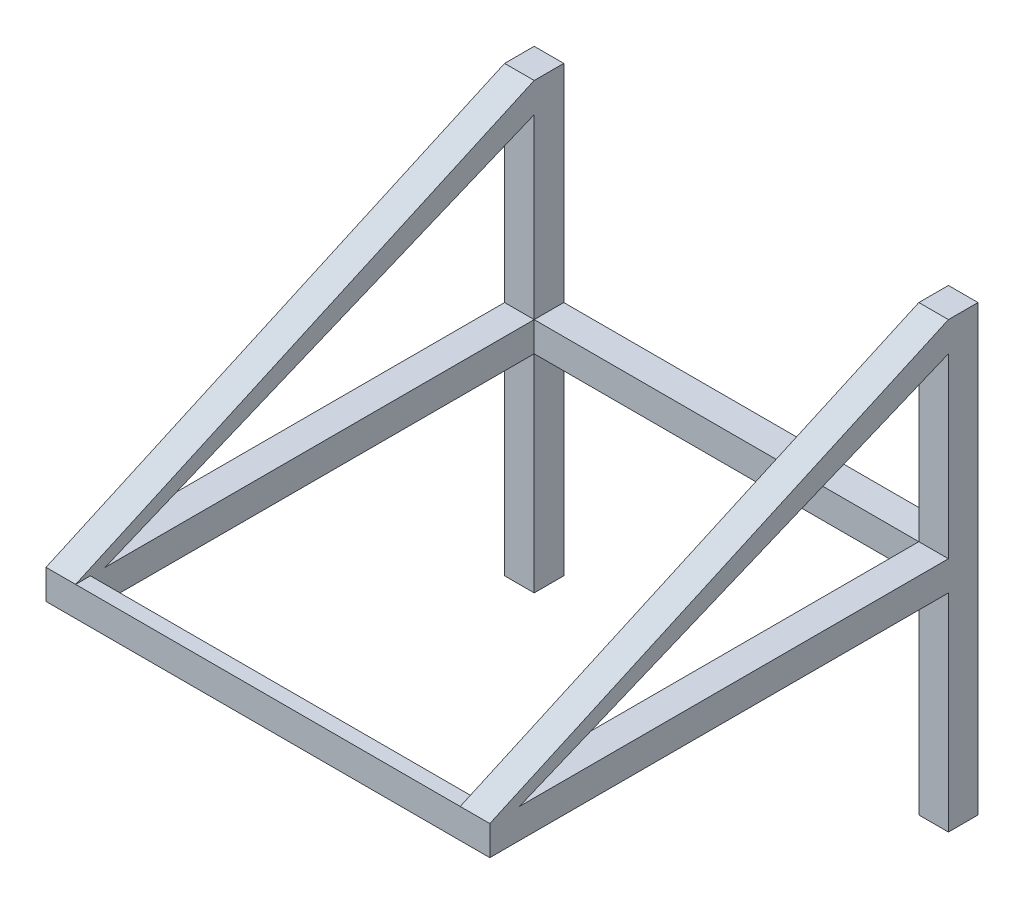
ISO-10303-21;
HEADER;
FILE_DESCRIPTION(('STEP AP214'),'2;1');
FILE_NAME('part.step','',(''),(''),'','','');
FILE_SCHEMA(('AUTOMOTIVE_DESIGN { 1 0 10303 214 1 1 1 1 }'));
ENDSEC;
DATA;
#1=APPLICATION_CONTEXT('core data for automotive mechanical design processes');
#2=APPLICATION_PROTOCOL_DEFINITION('international standard','automotive_design',2000,#1);
#3=PRODUCT_CONTEXT('',#1,'mechanical');
#4=PRODUCT('Part','Part','',(#3));
#5=PRODUCT_RELATED_PRODUCT_CATEGORY('part','',(#4));
#6=PRODUCT_DEFINITION_FORMATION('','',#4);
#7=PRODUCT_DEFINITION_CONTEXT('part definition',#1,'design');
#8=PRODUCT_DEFINITION('design','',#6,#7);
#9=PRODUCT_DEFINITION_SHAPE('','',#8);
#10=(LENGTH_UNIT() NAMED_UNIT(*) SI_UNIT(.MILLI.,.METRE.));
#11=(NAMED_UNIT(*) PLANE_ANGLE_UNIT() SI_UNIT($,.RADIAN.));
#12=(NAMED_UNIT(*) SI_UNIT($,.STERADIAN.) SOLID_ANGLE_UNIT());
#13=UNCERTAINTY_MEASURE_WITH_UNIT(LENGTH_MEASURE(1.E-05),#10,'distance_accuracy_value','');
#14=(GEOMETRIC_REPRESENTATION_CONTEXT(3) GLOBAL_UNCERTAINTY_ASSIGNED_CONTEXT((#13)) GLOBAL_UNIT_ASSIGNED_CONTEXT((#10,
#11,#12)) REPRESENTATION_CONTEXT('',''));
#15=CARTESIAN_POINT('',(0.,0.,0.));
#16=DIRECTION('',(0.,0.,1.));
#17=DIRECTION('',(1.,0.,0.));
#18=AXIS2_PLACEMENT_3D('',#15,#16,#17);
#19=CARTESIAN_POINT('',(101.6,812.8,1625.6));
#20=DIRECTION('',(0.,-1.,0.));
#21=DIRECTION('',(0.,0.,-1.));
#22=AXIS2_PLACEMENT_3D('',#19,#20,#21);
#23=PLANE('',#22);
#24=DIRECTION('',(0.,0.,-1.));
#25=VECTOR('',#24,1.);
#26=CARTESIAN_POINT('',(0.,812.8,1625.6));
#27=LINE('',#26,#25);
#28=CARTESIAN_POINT('',(0.,812.8,1574.8));
#29=VERTEX_POINT('',#28);
#30=CARTESIAN_POINT('',(0.,812.8,101.6));
#31=VERTEX_POINT('',#30);
#32=EDGE_CURVE('E408',#29,#31,#27,.T.);
#33=ORIENTED_EDGE('',*,*,#32,.F.);
#34=DIRECTION('',(-1.,0.,0.));
#35=VECTOR('',#34,1.);
#36=CARTESIAN_POINT('',(0.,812.8,1574.8));
#37=LINE('',#36,#35);
#38=CARTESIAN_POINT('',(101.6,812.8,1574.8));
#39=VERTEX_POINT('',#38);
#40=EDGE_CURVE('E567',#39,#29,#37,.T.);
#41=ORIENTED_EDGE('',*,*,#40,.F.);
#42=DIRECTION('',(0.,0.,-1.));
#43=VECTOR('',#42,1.);
#44=CARTESIAN_POINT('',(101.6,812.8,1625.6));
#45=LINE('',#44,#43);
#46=CARTESIAN_POINT('',(101.6,812.8,101.6));
#47=VERTEX_POINT('',#46);
#48=EDGE_CURVE('E308',#39,#47,#45,.T.);
#49=ORIENTED_EDGE('',*,*,#48,.T.);
#50=DIRECTION('',(-1.,0.,0.));
#51=VECTOR('',#50,1.);
#52=CARTESIAN_POINT('',(101.6,812.8,101.6));
#53=LINE('',#52,#51);
#54=EDGE_CURVE('E569',#47,#31,#53,.T.);
#55=ORIENTED_EDGE('',*,*,#54,.T.);
#56=EDGE_LOOP('',(#33,#41,#49,#55));
#57=FACE_BOUND('',#56,.T.);
#58=ADVANCED_FACE('F51',(#57),#23,.F.);
#59=DIRECTION('',(-1.,0.,0.));
#60=VECTOR('',#59,1.);
#61=CARTESIAN_POINT('',(1524.,812.8,1625.6));
#62=LINE('',#61,#60);
#63=CARTESIAN_POINT('',(1422.4,812.8,1625.6));
#64=VERTEX_POINT('',#63);
#65=CARTESIAN_POINT('',(101.6,812.8,1625.6));
#66=VERTEX_POINT('',#65);
#67=EDGE_CURVE('E319',#64,#66,#62,.T.);
#68=ORIENTED_EDGE('',*,*,#67,.T.);
#69=DIRECTION('',(0.,0.,-1.));
#70=VECTOR('',#69,1.);
#71=CARTESIAN_POINT('',(101.6,812.8,1676.4));
#72=LINE('',#71,#70);
#73=CARTESIAN_POINT('',(101.6,812.8,1676.4));
#74=VERTEX_POINT('',#73);
#75=EDGE_CURVE('E235',#74,#66,#72,.T.);
#76=ORIENTED_EDGE('',*,*,#75,.F.);
#77=DIRECTION('',(-1.,0.,0.));
#78=VECTOR('',#77,1.);
#79=CARTESIAN_POINT('',(1524.,812.8,1676.4));
#80=LINE('',#79,#78);
#81=CARTESIAN_POINT('',(1422.4,812.8,1676.4));
#82=VERTEX_POINT('',#81);
#83=EDGE_CURVE('E234',#82,#74,#80,.T.);
#84=ORIENTED_EDGE('',*,*,#83,.F.);
#85=DIRECTION('',(0.,0.,1.));
#86=VECTOR('',#85,1.);
#87=CARTESIAN_POINT('',(1422.4,812.8,1676.4));
#88=LINE('',#87,#86);
#89=EDGE_CURVE('E289',#64,#82,#88,.T.);
#90=ORIENTED_EDGE('',*,*,#89,.F.);
#91=EDGE_LOOP('',(#68,#76,#84,#90));
#92=FACE_BOUND('',#91,.T.);
#93=ADVANCED_FACE('F538',(#92),#23,.F.);
#94=CARTESIAN_POINT('',(0.,0.,101.6));
#95=DIRECTION('',(0.,0.,-1.));
#96=DIRECTION('',(-1.,0.,0.));
#97=AXIS2_PLACEMENT_3D('',#94,#95,#96);
#98=PLANE('',#97);
#99=DIRECTION('',(1.,0.,0.));
#100=VECTOR('',#99,1.);
#101=CARTESIAN_POINT('',(1422.4,711.2,101.6));
#102=LINE('',#101,#100);
#103=CARTESIAN_POINT('',(1422.4,711.2,101.6));
#104=VERTEX_POINT('',#103);
#105=CARTESIAN_POINT('',(1524.,711.2,101.6));
#106=VERTEX_POINT('',#105);
#107=EDGE_CURVE('E322',#104,#106,#102,.T.);
#108=ORIENTED_EDGE('',*,*,#107,.F.);
#109=DIRECTION('',(0.,1.,0.));
#110=VECTOR('',#109,1.);
#111=CARTESIAN_POINT('',(1422.4,0.,101.6));
#112=LINE('',#111,#110);
#113=CARTESIAN_POINT('',(1422.4,0.,101.6));
#114=VERTEX_POINT('',#113);
#115=EDGE_CURVE('E381',#114,#104,#112,.T.);
#116=ORIENTED_EDGE('',*,*,#115,.F.);
#117=DIRECTION('',(1.,0.,0.));
#118=VECTOR('',#117,1.);
#119=CARTESIAN_POINT('',(0.,0.,101.6));
#120=LINE('',#119,#118);
#121=CARTESIAN_POINT('',(1524.,0.,101.6));
#122=VERTEX_POINT('',#121);
#123=EDGE_CURVE('E407',#114,#122,#120,.T.);
#124=ORIENTED_EDGE('',*,*,#123,.T.);
#125=DIRECTION('',(0.,1.,0.));
#126=VECTOR('',#125,1.);
#127=CARTESIAN_POINT('',(1524.,0.,101.6));
#128=LINE('',#127,#126);
#129=EDGE_CURVE('E458',#122,#106,#128,.T.);
#130=ORIENTED_EDGE('',*,*,#129,.T.);
#131=EDGE_LOOP('',(#108,#116,#124,#130));
#132=FACE_BOUND('',#131,.T.);
#133=ADVANCED_FACE('F426',(#132),#98,.F.);
#134=DIRECTION('',(0.,-1.,0.));
#135=VECTOR('',#134,1.);
#136=CARTESIAN_POINT('',(1422.4,812.8,101.6));
#137=LINE('',#136,#135);
#138=CARTESIAN_POINT('',(1422.4,812.8,101.6));
#139=VERTEX_POINT('',#138);
#140=EDGE_CURVE('E243',#139,#104,#137,.T.);
#141=ORIENTED_EDGE('',*,*,#140,.F.);
#142=DIRECTION('',(1.,0.,0.));
#143=VECTOR('',#142,1.);
#144=CARTESIAN_POINT('',(101.6,812.8,101.6));
#145=LINE('',#144,#143);
#146=EDGE_CURVE('E354',#47,#139,#145,.T.);
#147=ORIENTED_EDGE('',*,*,#146,.F.);
#148=DIRECTION('',(0.,1.,0.));
#149=VECTOR('',#148,1.);
#150=CARTESIAN_POINT('',(101.6,812.8,101.6));
#151=LINE('',#150,#149);
#152=CARTESIAN_POINT('',(101.6,711.2,101.6));
#153=VERTEX_POINT('',#152);
#154=EDGE_CURVE('E795',#153,#47,#151,.T.);
#155=ORIENTED_EDGE('',*,*,#154,.F.);
#156=DIRECTION('',(-1.,0.,0.));
#157=VECTOR('',#156,1.);
#158=CARTESIAN_POINT('',(1422.4,711.2,101.6));
#159=LINE('',#158,#157);
#160=EDGE_CURVE('E384',#104,#153,#159,.T.);
#161=ORIENTED_EDGE('',*,*,#160,.F.);
#162=EDGE_LOOP('',(#141,#147,#155,#161));
#163=FACE_BOUND('',#162,.T.);
#164=ADVANCED_FACE('F677',(#163),#98,.F.);
#165=CARTESIAN_POINT('',(1524.,812.8,101.6));
#166=VERTEX_POINT('',#165);
#167=CARTESIAN_POINT('',(1524.,1422.4,101.6));
#168=VERTEX_POINT('',#167);
#169=EDGE_CURVE('E355',#166,#168,#128,.T.);
#170=ORIENTED_EDGE('',*,*,#169,.T.);
#171=DIRECTION('',(1.,0.,0.));
#172=VECTOR('',#171,1.);
#173=CARTESIAN_POINT('',(1422.4,1422.4,101.6));
#174=LINE('',#173,#172);
#175=CARTESIAN_POINT('',(1422.4,1422.4,101.6));
#176=VERTEX_POINT('',#175);
#177=EDGE_CURVE('E346',#176,#168,#174,.T.);
#178=ORIENTED_EDGE('',*,*,#177,.F.);
#179=DIRECTION('',(0.,1.,0.));
#180=VECTOR('',#179,1.);
#181=CARTESIAN_POINT('',(1422.4,1524.,101.6));
#182=LINE('',#181,#180);
#183=EDGE_CURVE('E349',#139,#176,#182,.T.);
#184=ORIENTED_EDGE('',*,*,#183,.F.);
#185=DIRECTION('',(-1.,0.,0.));
#186=VECTOR('',#185,1.);
#187=CARTESIAN_POINT('',(1422.4,812.8,101.6));
#188=LINE('',#187,#186);
#189=EDGE_CURVE('E325',#166,#139,#188,.T.);
#190=ORIENTED_EDGE('',*,*,#189,.F.);
#191=EDGE_LOOP('',(#170,#178,#184,#190));
#192=FACE_BOUND('',#191,.T.);
#193=ADVANCED_FACE('F424',(#192),#98,.F.);
#194=DIRECTION('',(1.,0.,0.));
#195=VECTOR('',#194,1.);
#196=CARTESIAN_POINT('',(101.6,711.2,101.6));
#197=LINE('',#196,#195);
#198=CARTESIAN_POINT('',(0.,711.2,101.6));
#199=VERTEX_POINT('',#198);
#200=EDGE_CURVE('E791',#199,#153,#197,.T.);
#201=ORIENTED_EDGE('',*,*,#200,.F.);
#202=DIRECTION('',(0.,-1.,0.));
#203=VECTOR('',#202,1.);
#204=CARTESIAN_POINT('',(0.,0.,101.6));
#205=LINE('',#204,#203);
#206=CARTESIAN_POINT('',(0.,0.,101.6));
#207=VERTEX_POINT('',#206);
#208=EDGE_CURVE('E398',#199,#207,#205,.T.);
#209=ORIENTED_EDGE('',*,*,#208,.T.);
#210=CARTESIAN_POINT('',(101.6,-1.49308937752045E-13,101.6));
#211=VERTEX_POINT('',#210);
#212=EDGE_CURVE('E403',#207,#211,#120,.T.);
#213=ORIENTED_EDGE('',*,*,#212,.T.);
#214=DIRECTION('',(0.,-1.,0.));
#215=VECTOR('',#214,1.);
#216=CARTESIAN_POINT('',(101.6,-1.49308937752045E-13,101.6));
#217=LINE('',#216,#215);
#218=EDGE_CURVE('E374',#153,#211,#217,.T.);
#219=ORIENTED_EDGE('',*,*,#218,.F.);
#220=EDGE_LOOP('',(#201,#209,#213,#219));
#221=FACE_BOUND('',#220,.T.);
#222=ADVANCED_FACE('F414',(#221),#98,.F.);
#223=DIRECTION('',(0.,-1.,0.));
#224=VECTOR('',#223,1.);
#225=CARTESIAN_POINT('',(101.6,1524.,101.6));
#226=LINE('',#225,#224);
#227=CARTESIAN_POINT('',(101.6,1422.4,101.6));
#228=VERTEX_POINT('',#227);
#229=EDGE_CURVE('E76',#228,#47,#226,.T.);
#230=ORIENTED_EDGE('',*,*,#229,.F.);
#231=DIRECTION('',(1.,0.,0.));
#232=VECTOR('',#231,1.);
#233=CARTESIAN_POINT('',(0.,1422.4,101.6));
#234=LINE('',#233,#232);
#235=CARTESIAN_POINT('',(0.,1422.4,101.6));
#236=VERTEX_POINT('',#235);
#237=EDGE_CURVE('E302',#236,#228,#234,.T.);
#238=ORIENTED_EDGE('',*,*,#237,.F.);
#239=EDGE_CURVE('E401',#236,#31,#205,.T.);
#240=ORIENTED_EDGE('',*,*,#239,.T.);
#241=ORIENTED_EDGE('',*,*,#54,.F.);
#242=EDGE_LOOP('',(#230,#238,#240,#241));
#243=FACE_BOUND('',#242,.T.);
#244=ADVANCED_FACE('F423',(#243),#98,.F.);
#245=CARTESIAN_POINT('',(0.,0.,101.6));
#246=DIRECTION('',(0.,1.,0.));
#247=DIRECTION('',(0.,0.,1.));
#248=AXIS2_PLACEMENT_3D('',#245,#246,#247);
#249=PLANE('',#248);
#250=ORIENTED_EDGE('',*,*,#123,.F.);
#251=DIRECTION('',(0.,0.,1.));
#252=VECTOR('',#251,1.);
#253=CARTESIAN_POINT('',(1422.4,0.,0.));
#254=LINE('',#253,#252);
#255=CARTESIAN_POINT('',(1422.4,0.,0.));
#256=VERTEX_POINT('',#255);
#257=EDGE_CURVE('E388',#256,#114,#254,.T.);
#258=ORIENTED_EDGE('',*,*,#257,.F.);
#259=DIRECTION('',(1.,0.,0.));
#260=VECTOR('',#259,1.);
#261=CARTESIAN_POINT('',(0.,0.,0.));
#262=LINE('',#261,#260);
#263=CARTESIAN_POINT('',(1524.,0.,0.));
#264=VERTEX_POINT('',#263);
#265=EDGE_CURVE('E452',#256,#264,#262,.T.);
#266=ORIENTED_EDGE('',*,*,#265,.T.);
#267=DIRECTION('',(0.,0.,-1.));
#268=VECTOR('',#267,1.);
#269=CARTESIAN_POINT('',(1524.,0.,101.6));
#270=LINE('',#269,#268);
#271=EDGE_CURVE('E60',#122,#264,#270,.T.);
#272=ORIENTED_EDGE('',*,*,#271,.F.);
#273=EDGE_LOOP('',(#250,#258,#266,#272));
#274=FACE_BOUND('',#273,.T.);
#275=ADVANCED_FACE('F604',(#274),#249,.F.);
#276=CARTESIAN_POINT('',(0.,1524.,101.6));
#277=DIRECTION('',(0.,-1.,0.));
#278=DIRECTION('',(0.,0.,-1.));
#279=AXIS2_PLACEMENT_3D('',#276,#277,#278);
#280=PLANE('',#279);
#281=CARTESIAN_POINT('',(101.6,1524.,101.6));
#282=DIRECTION('',(-1.,0.,0.));
#283=VECTOR('',#282,1.);
#284=LINE('',#281,#283);
#285=CARTESIAN_POINT('',(101.6,1524.,101.6));
#286=VERTEX_POINT('',#285);
#287=CARTESIAN_POINT('',(0.,1524.,101.6));
#288=VERTEX_POINT('',#287);
#289=EDGE_CURVE('E218',#286,#288,#284,.T.);
#290=ORIENTED_EDGE('',*,*,#289,.F.);
#291=DIRECTION('',(0.,0.,1.));
#292=VECTOR('',#291,1.);
#293=CARTESIAN_POINT('',(101.6,1524.,0.));
#294=LINE('',#293,#292);
#295=CARTESIAN_POINT('',(101.6,1524.,0.));
#296=VERTEX_POINT('',#295);
#297=EDGE_CURVE('E265',#296,#286,#294,.T.);
#298=ORIENTED_EDGE('',*,*,#297,.F.);
#299=DIRECTION('',(-1.,0.,0.));
#300=VECTOR('',#299,1.);
#301=CARTESIAN_POINT('',(0.,1524.,0.));
#302=LINE('',#301,#300);
#303=CARTESIAN_POINT('',(0.,1524.,0.));
#304=VERTEX_POINT('',#303);
#305=EDGE_CURVE('E464',#296,#304,#302,.T.);
#306=ORIENTED_EDGE('',*,*,#305,.T.);
#307=DIRECTION('',(0.,0.,-1.));
#308=VECTOR('',#307,1.);
#309=CARTESIAN_POINT('',(0.,1524.,101.6));
#310=LINE('',#309,#308);
#311=EDGE_CURVE('E252',#288,#304,#310,.T.);
#312=ORIENTED_EDGE('',*,*,#311,.F.);
#313=EDGE_LOOP('',(#290,#298,#306,#312));
#314=FACE_BOUND('',#313,.T.);
#315=ADVANCED_FACE('F280',(#314),#280,.F.);
#316=CARTESIAN_POINT('',(0.,0.,101.6));
#317=DIRECTION('',(1.,0.,0.));
#318=DIRECTION('',(0.,0.,-1.));
#319=AXIS2_PLACEMENT_3D('',#316,#317,#318);
#320=PLANE('',#319);
#321=ORIENTED_EDGE('',*,*,#239,.F.);
#322=DIRECTION('',(0.,0.3823517927263,-0.924016832421891));
#323=VECTOR('',#322,1.);
#324=CARTESIAN_POINT('',(0.,812.8,1574.8));
#325=LINE('',#324,#323);
#326=EDGE_CURVE('E68',#29,#236,#325,.T.);
#327=ORIENTED_EDGE('',*,*,#326,.F.);
#328=ORIENTED_EDGE('',*,*,#32,.T.);
#329=EDGE_LOOP('',(#321,#327,#328));
#330=FACE_BOUND('',#329,.T.);
#331=DIRECTION('',(0.,-1.,0.));
#332=VECTOR('',#331,1.);
#333=CARTESIAN_POINT('',(0.,0.,0.));
#334=LINE('',#333,#332);
#335=CARTESIAN_POINT('',(0.,0.,0.));
#336=VERTEX_POINT('',#335);
#337=EDGE_CURVE('E450',#304,#336,#334,.T.);
#338=ORIENTED_EDGE('',*,*,#337,.T.);
#339=DIRECTION('',(0.,0.,-1.));
#340=VECTOR('',#339,1.);
#341=CARTESIAN_POINT('',(0.,0.,101.6));
#342=LINE('',#341,#340);
#343=EDGE_CURVE('E12',#207,#336,#342,.T.);
#344=ORIENTED_EDGE('',*,*,#343,.F.);
#345=ORIENTED_EDGE('',*,*,#208,.F.);
#346=DIRECTION('',(0.,0.,-1.));
#347=VECTOR('',#346,1.);
#348=CARTESIAN_POINT('',(0.,711.2,1625.6));
#349=LINE('',#348,#347);
#350=CARTESIAN_POINT('',(0.,711.2,1676.4));
#351=VERTEX_POINT('',#350);
#352=EDGE_CURVE('E239',#351,#199,#349,.T.);
#353=ORIENTED_EDGE('',*,*,#352,.F.);
#354=DIRECTION('',(0.,-1.,0.));
#355=VECTOR('',#354,1.);
#356=CARTESIAN_POINT('',(0.,812.8,1676.4));
#357=LINE('',#356,#355);
#358=CARTESIAN_POINT('',(0.,812.8,1676.4));
#359=VERTEX_POINT('',#358);
#360=EDGE_CURVE('E230',#359,#351,#357,.T.);
#361=ORIENTED_EDGE('',*,*,#360,.F.);
#362=DIRECTION('',(0.,0.411586722426498,-0.911370599658675));
#363=VECTOR('',#362,1.);
#364=CARTESIAN_POINT('',(0.,812.8,1676.4));
#365=LINE('',#364,#363);
#366=EDGE_CURVE('E211',#359,#288,#365,.T.);
#367=ORIENTED_EDGE('',*,*,#366,.T.);
#368=ORIENTED_EDGE('',*,*,#311,.T.);
#369=EDGE_LOOP('',(#338,#344,#345,#353,#361,#367,#368));
#370=FACE_BOUND('',#369,.T.);
#371=ADVANCED_FACE('F53',(#330,#370),#320,.F.);
#372=CARTESIAN_POINT('',(101.6,-1.49308937752045E-13,0.));
#373=VERTEX_POINT('',#372);
#374=EDGE_CURVE('E456',#336,#373,#262,.T.);
#375=ORIENTED_EDGE('',*,*,#374,.T.);
#376=DIRECTION('',(0.,0.,1.));
#377=VECTOR('',#376,1.);
#378=CARTESIAN_POINT('',(101.6,-1.49308937752045E-13,0.));
#379=LINE('',#378,#377);
#380=EDGE_CURVE('E390',#373,#211,#379,.T.);
#381=ORIENTED_EDGE('',*,*,#380,.T.);
#382=ORIENTED_EDGE('',*,*,#212,.F.);
#383=ORIENTED_EDGE('',*,*,#343,.T.);
#384=EDGE_LOOP('',(#375,#381,#382,#383));
#385=FACE_BOUND('',#384,.T.);
#386=ADVANCED_FACE('F610',(#385),#249,.F.);
#387=CARTESIAN_POINT('',(1524.,0.,101.6));
#388=DIRECTION('',(-1.,0.,0.));
#389=DIRECTION('',(0.,0.,1.));
#390=AXIS2_PLACEMENT_3D('',#387,#388,#389);
#391=PLANE('',#390);
#392=DIRECTION('',(0.,0.,-1.));
#393=VECTOR('',#392,1.);
#394=CARTESIAN_POINT('',(1524.,1524.,101.6));
#395=LINE('',#394,#393);
#396=CARTESIAN_POINT('',(1524.,1524.,101.6));
#397=VERTEX_POINT('',#396);
#398=CARTESIAN_POINT('',(1524.,1524.,0.));
#399=VERTEX_POINT('',#398);
#400=EDGE_CURVE('E254',#397,#399,#395,.T.);
#401=ORIENTED_EDGE('',*,*,#400,.F.);
#402=DIRECTION('',(0.,0.411586722426498,-0.911370599658675));
#403=VECTOR('',#402,1.);
#404=CARTESIAN_POINT('',(1524.,812.8,1676.4));
#405=LINE('',#404,#403);
#406=CARTESIAN_POINT('',(1524.,812.8,1676.4));
#407=VERTEX_POINT('',#406);
#408=EDGE_CURVE('E446',#407,#397,#405,.T.);
#409=ORIENTED_EDGE('',*,*,#408,.F.);
#410=DIRECTION('',(0.,1.,0.));
#411=VECTOR('',#410,1.);
#412=CARTESIAN_POINT('',(1524.,812.8,1676.4));
#413=LINE('',#412,#411);
#414=CARTESIAN_POINT('',(1524.,711.2,1676.4));
#415=VERTEX_POINT('',#414);
#416=EDGE_CURVE('E307',#415,#407,#413,.T.);
#417=ORIENTED_EDGE('',*,*,#416,.F.);
#418=DIRECTION('',(0.,0.,-1.));
#419=VECTOR('',#418,1.);
#420=CARTESIAN_POINT('',(1524.,711.2,1625.6));
#421=LINE('',#420,#419);
#422=EDGE_CURVE('E339',#415,#106,#421,.T.);
#423=ORIENTED_EDGE('',*,*,#422,.T.);
#424=ORIENTED_EDGE('',*,*,#129,.F.);
#425=ORIENTED_EDGE('',*,*,#271,.T.);
#426=DIRECTION('',(0.,1.,0.));
#427=VECTOR('',#426,1.);
#428=CARTESIAN_POINT('',(1524.,0.,0.));
#429=LINE('',#428,#427);
#430=EDGE_CURVE('E462',#264,#399,#429,.T.);
#431=ORIENTED_EDGE('',*,*,#430,.T.);
#432=EDGE_LOOP('',(#401,#409,#417,#423,#424,#425,#431));
#433=FACE_BOUND('',#432,.T.);
#434=DIRECTION('',(0.,0.3823517927263,-0.924016832421891));
#435=VECTOR('',#434,1.);
#436=CARTESIAN_POINT('',(1524.,812.8,1574.8));
#437=LINE('',#436,#435);
#438=CARTESIAN_POINT('',(1524.,812.8,1574.8));
#439=VERTEX_POINT('',#438);
#440=EDGE_CURVE('E491',#439,#168,#437,.T.);
#441=ORIENTED_EDGE('',*,*,#440,.T.);
#442=ORIENTED_EDGE('',*,*,#169,.F.);
#443=DIRECTION('',(0.,0.,-1.));
#444=VECTOR('',#443,1.);
#445=CARTESIAN_POINT('',(1524.,812.8,1625.6));
#446=LINE('',#445,#444);
#447=EDGE_CURVE('E336',#439,#166,#446,.T.);
#448=ORIENTED_EDGE('',*,*,#447,.F.);
#449=EDGE_LOOP('',(#441,#442,#448));
#450=FACE_BOUND('',#449,.T.);
#451=ADVANCED_FACE('F278',(#433,#450),#391,.F.);
#452=CARTESIAN_POINT('',(1422.4,1524.,0.));
#453=VERTEX_POINT('',#452);
#454=EDGE_CURVE('E402',#399,#453,#302,.T.);
#455=ORIENTED_EDGE('',*,*,#454,.T.);
#456=DIRECTION('',(0.,0.,1.));
#457=VECTOR('',#456,1.);
#458=CARTESIAN_POINT('',(1422.4,1524.,0.));
#459=LINE('',#458,#457);
#460=CARTESIAN_POINT('',(1422.4,1524.,101.6));
#461=VERTEX_POINT('',#460);
#462=EDGE_CURVE('E365',#453,#461,#459,.T.);
#463=ORIENTED_EDGE('',*,*,#462,.T.);
#464=CARTESIAN_POINT('',(1524.,1524.,101.6));
#465=DIRECTION('',(-1.,0.,0.));
#466=VECTOR('',#465,1.);
#467=LINE('',#464,#466);
#468=EDGE_CURVE('E255',#397,#461,#467,.T.);
#469=ORIENTED_EDGE('',*,*,#468,.F.);
#470=ORIENTED_EDGE('',*,*,#400,.T.);
#471=EDGE_LOOP('',(#455,#463,#469,#470));
#472=FACE_BOUND('',#471,.T.);
#473=ADVANCED_FACE('F267',(#472),#280,.F.);
#474=CARTESIAN_POINT('',(0.,0.,0.));
#475=DIRECTION('',(0.,0.,-1.));
#476=DIRECTION('',(-1.,0.,0.));
#477=AXIS2_PLACEMENT_3D('',#474,#475,#476);
#478=PLANE('',#477);
#479=DIRECTION('',(0.,-1.,0.));
#480=VECTOR('',#479,1.);
#481=CARTESIAN_POINT('',(101.6,1524.,0.));
#482=LINE('',#481,#480);
#483=CARTESIAN_POINT('',(101.6,812.8,0.));
#484=VERTEX_POINT('',#483);
#485=EDGE_CURVE('E353',#296,#484,#482,.T.);
#486=ORIENTED_EDGE('',*,*,#485,.T.);
#487=DIRECTION('',(1.,0.,0.));
#488=VECTOR('',#487,1.);
#489=CARTESIAN_POINT('',(101.6,812.8,0.));
#490=LINE('',#489,#488);
#491=CARTESIAN_POINT('',(1422.4,812.8,0.));
#492=VERTEX_POINT('',#491);
#493=EDGE_CURVE('E580',#484,#492,#490,.T.);
#494=ORIENTED_EDGE('',*,*,#493,.T.);
#495=DIRECTION('',(0.,1.,0.));
#496=VECTOR('',#495,1.);
#497=CARTESIAN_POINT('',(1422.4,1524.,0.));
#498=LINE('',#497,#496);
#499=EDGE_CURVE('E369',#492,#453,#498,.T.);
#500=ORIENTED_EDGE('',*,*,#499,.T.);
#501=ORIENTED_EDGE('',*,*,#454,.F.);
#502=ORIENTED_EDGE('',*,*,#430,.F.);
#503=ORIENTED_EDGE('',*,*,#265,.F.);
#504=DIRECTION('',(0.,1.,0.));
#505=VECTOR('',#504,1.);
#506=CARTESIAN_POINT('',(1422.4,0.,0.));
#507=LINE('',#506,#505);
#508=CARTESIAN_POINT('',(1422.4,711.2,0.));
#509=VERTEX_POINT('',#508);
#510=EDGE_CURVE('E370',#256,#509,#507,.T.);
#511=ORIENTED_EDGE('',*,*,#510,.T.);
#512=DIRECTION('',(-1.,0.,0.));
#513=VECTOR('',#512,1.);
#514=CARTESIAN_POINT('',(1422.4,711.2,0.));
#515=LINE('',#514,#513);
#516=CARTESIAN_POINT('',(101.6,711.2,0.));
#517=VERTEX_POINT('',#516);
#518=EDGE_CURVE('E373',#509,#517,#515,.T.);
#519=ORIENTED_EDGE('',*,*,#518,.T.);
#520=DIRECTION('',(0.,-1.,0.));
#521=VECTOR('',#520,1.);
#522=CARTESIAN_POINT('',(101.6,-1.49308937752045E-13,0.));
#523=LINE('',#522,#521);
#524=EDGE_CURVE('E377',#517,#373,#523,.T.);
#525=ORIENTED_EDGE('',*,*,#524,.T.);
#526=ORIENTED_EDGE('',*,*,#374,.F.);
#527=ORIENTED_EDGE('',*,*,#337,.F.);
#528=ORIENTED_EDGE('',*,*,#305,.F.);
#529=EDGE_LOOP('',(#486,#494,#500,#501,#502,#503,#511,#519,#525,#526,#527,#528));
#530=FACE_BOUND('',#529,.T.);
#531=ADVANCED_FACE('F277',(#530),#478,.T.);
#532=CARTESIAN_POINT('',(1422.4,0.,0.));
#533=DIRECTION('',(1.,0.,0.));
#534=DIRECTION('',(0.,0.,-1.));
#535=AXIS2_PLACEMENT_3D('',#532,#533,#534);
#536=PLANE('',#535);
#537=ORIENTED_EDGE('',*,*,#115,.T.);
#538=DIRECTION('',(0.,0.,1.));
#539=VECTOR('',#538,1.);
#540=CARTESIAN_POINT('',(1422.4,711.2,0.));
#541=LINE('',#540,#539);
#542=EDGE_CURVE('E380',#509,#104,#541,.T.);
#543=ORIENTED_EDGE('',*,*,#542,.F.);
#544=ORIENTED_EDGE('',*,*,#510,.F.);
#545=ORIENTED_EDGE('',*,*,#257,.T.);
#546=EDGE_LOOP('',(#537,#543,#544,#545));
#547=FACE_BOUND('',#546,.T.);
#548=ADVANCED_FACE('F427',(#547),#536,.F.);
#549=CARTESIAN_POINT('',(101.6,-1.49308937752045E-13,0.));
#550=DIRECTION('',(-1.,0.,0.));
#551=DIRECTION('',(0.,-1.,0.));
#552=AXIS2_PLACEMENT_3D('',#549,#550,#551);
#553=PLANE('',#552);
#554=ORIENTED_EDGE('',*,*,#218,.T.);
#555=ORIENTED_EDGE('',*,*,#380,.F.);
#556=ORIENTED_EDGE('',*,*,#524,.F.);
#557=DIRECTION('',(0.,0.,1.));
#558=VECTOR('',#557,1.);
#559=CARTESIAN_POINT('',(101.6,711.2,0.));
#560=LINE('',#559,#558);
#561=EDGE_CURVE('E393',#517,#153,#560,.T.);
#562=ORIENTED_EDGE('',*,*,#561,.T.);
#563=EDGE_LOOP('',(#554,#555,#556,#562));
#564=FACE_BOUND('',#563,.T.);
#565=ADVANCED_FACE('F550',(#564),#553,.F.);
#566=CARTESIAN_POINT('',(1422.4,711.2,0.));
#567=DIRECTION('',(0.,1.,0.));
#568=DIRECTION('',(0.,0.,1.));
#569=AXIS2_PLACEMENT_3D('',#566,#567,#568);
#570=PLANE('',#569);
#571=ORIENTED_EDGE('',*,*,#160,.T.);
#572=ORIENTED_EDGE('',*,*,#561,.F.);
#573=ORIENTED_EDGE('',*,*,#518,.F.);
#574=ORIENTED_EDGE('',*,*,#542,.T.);
#575=EDGE_LOOP('',(#571,#572,#573,#574));
#576=FACE_BOUND('',#575,.T.);
#577=ADVANCED_FACE('F549',(#576),#570,.F.);
#578=CARTESIAN_POINT('',(101.6,1524.,0.));
#579=DIRECTION('',(-1.,0.,0.));
#580=DIRECTION('',(0.,-1.,0.));
#581=AXIS2_PLACEMENT_3D('',#578,#579,#580);
#582=PLANE('',#581);
#583=ORIENTED_EDGE('',*,*,#297,.T.);
#584=DIRECTION('',(0.,0.411586722426498,-0.911370599658675));
#585=VECTOR('',#584,1.);
#586=CARTESIAN_POINT('',(101.6,812.8,1676.4));
#587=LINE('',#586,#585);
#588=EDGE_CURVE('E776',#74,#286,#587,.T.);
#589=ORIENTED_EDGE('',*,*,#588,.F.);
#590=ORIENTED_EDGE('',*,*,#75,.T.);
#591=DIRECTION('',(0.,1.,0.));
#592=VECTOR('',#591,1.);
#593=CARTESIAN_POINT('',(101.6,812.8,1625.6));
#594=LINE('',#593,#592);
#595=CARTESIAN_POINT('',(101.6,711.2,1625.6));
#596=VERTEX_POINT('',#595);
#597=EDGE_CURVE('E413',#596,#66,#594,.T.);
#598=ORIENTED_EDGE('',*,*,#597,.F.);
#599=DIRECTION('',(0.,0.,-1.));
#600=VECTOR('',#599,1.);
#601=CARTESIAN_POINT('',(101.6,711.2,1625.6));
#602=LINE('',#601,#600);
#603=EDGE_CURVE('E570',#596,#153,#602,.T.);
#604=ORIENTED_EDGE('',*,*,#603,.T.);
#605=ORIENTED_EDGE('',*,*,#154,.T.);
#606=ORIENTED_EDGE('',*,*,#48,.F.);
#607=DIRECTION('',(0.,0.3823517927263,-0.924016832421891));
#608=VECTOR('',#607,1.);
#609=CARTESIAN_POINT('',(101.6,812.8,1574.8));
#610=LINE('',#609,#608);
#611=EDGE_CURVE('E769',#39,#228,#610,.T.);
#612=ORIENTED_EDGE('',*,*,#611,.T.);
#613=ORIENTED_EDGE('',*,*,#229,.T.);
#614=DIRECTION('',(0.,0.,1.));
#615=VECTOR('',#614,1.);
#616=CARTESIAN_POINT('',(101.6,812.8,0.));
#617=LINE('',#616,#615);
#618=EDGE_CURVE('E366',#484,#47,#617,.T.);
#619=ORIENTED_EDGE('',*,*,#618,.F.);
#620=ORIENTED_EDGE('',*,*,#485,.F.);
#621=EDGE_LOOP('',(#583,#589,#590,#598,#604,#605,#606,#612,#613,#619,#620));
#622=FACE_BOUND('',#621,.T.);
#623=ADVANCED_FACE('F542',(#622),#582,.F.);
#624=CARTESIAN_POINT('',(1422.4,1524.,0.));
#625=DIRECTION('',(1.,0.,0.));
#626=DIRECTION('',(0.,0.,-1.));
#627=AXIS2_PLACEMENT_3D('',#624,#625,#626);
#628=PLANE('',#627);
#629=ORIENTED_EDGE('',*,*,#183,.T.);
#630=DIRECTION('',(0.,0.3823517927263,-0.924016832421891));
#631=VECTOR('',#630,1.);
#632=CARTESIAN_POINT('',(1422.4,812.8,1574.8));
#633=LINE('',#632,#631);
#634=CARTESIAN_POINT('',(1422.4,812.8,1574.8));
#635=VERTEX_POINT('',#634);
#636=EDGE_CURVE('E296',#635,#176,#633,.T.);
#637=ORIENTED_EDGE('',*,*,#636,.F.);
#638=DIRECTION('',(0.,0.,-1.));
#639=VECTOR('',#638,1.);
#640=CARTESIAN_POINT('',(1422.4,812.8,1625.6));
#641=LINE('',#640,#639);
#642=EDGE_CURVE('E334',#635,#139,#641,.T.);
#643=ORIENTED_EDGE('',*,*,#642,.T.);
#644=ORIENTED_EDGE('',*,*,#140,.T.);
#645=DIRECTION('',(0.,0.,-1.));
#646=VECTOR('',#645,1.);
#647=CARTESIAN_POINT('',(1422.4,711.2,1625.6));
#648=LINE('',#647,#646);
#649=CARTESIAN_POINT('',(1422.4,711.2,1625.6));
#650=VERTEX_POINT('',#649);
#651=EDGE_CURVE('E794',#650,#104,#648,.T.);
#652=ORIENTED_EDGE('',*,*,#651,.F.);
#653=DIRECTION('',(0.,-1.,0.));
#654=VECTOR('',#653,1.);
#655=CARTESIAN_POINT('',(1422.4,812.8,1625.6));
#656=LINE('',#655,#654);
#657=EDGE_CURVE('E328',#64,#650,#656,.T.);
#658=ORIENTED_EDGE('',*,*,#657,.F.);
#659=ORIENTED_EDGE('',*,*,#89,.T.);
#660=DIRECTION('',(0.,0.411586722426498,-0.911370599658675));
#661=VECTOR('',#660,1.);
#662=CARTESIAN_POINT('',(1422.4,812.8,1676.4));
#663=LINE('',#662,#661);
#664=EDGE_CURVE('E489',#82,#461,#663,.T.);
#665=ORIENTED_EDGE('',*,*,#664,.T.);
#666=ORIENTED_EDGE('',*,*,#462,.F.);
#667=ORIENTED_EDGE('',*,*,#499,.F.);
#668=DIRECTION('',(0.,0.,1.));
#669=VECTOR('',#668,1.);
#670=CARTESIAN_POINT('',(1422.4,812.8,0.));
#671=LINE('',#670,#669);
#672=EDGE_CURVE('E362',#492,#139,#671,.T.);
#673=ORIENTED_EDGE('',*,*,#672,.T.);
#674=EDGE_LOOP('',(#629,#637,#643,#644,#652,#658,#659,#665,#666,#667,#673));
#675=FACE_BOUND('',#674,.T.);
#676=ADVANCED_FACE('F539',(#675),#628,.F.);
#677=CARTESIAN_POINT('',(101.6,812.8,0.));
#678=DIRECTION('',(0.,-1.,0.));
#679=DIRECTION('',(1.,0.,0.));
#680=AXIS2_PLACEMENT_3D('',#677,#678,#679);
#681=PLANE('',#680);
#682=ORIENTED_EDGE('',*,*,#146,.T.);
#683=ORIENTED_EDGE('',*,*,#672,.F.);
#684=ORIENTED_EDGE('',*,*,#493,.F.);
#685=ORIENTED_EDGE('',*,*,#618,.T.);
#686=EDGE_LOOP('',(#682,#683,#684,#685));
#687=FACE_BOUND('',#686,.T.);
#688=ADVANCED_FACE('F536',(#687),#681,.F.);
#689=ORIENTED_EDGE('',*,*,#642,.F.);
#690=DIRECTION('',(-1.,0.,0.));
#691=VECTOR('',#690,1.);
#692=CARTESIAN_POINT('',(1524.,812.8,1574.8));
#693=LINE('',#692,#691);
#694=EDGE_CURVE('E297',#439,#635,#693,.T.);
#695=ORIENTED_EDGE('',*,*,#694,.F.);
#696=ORIENTED_EDGE('',*,*,#447,.T.);
#697=ORIENTED_EDGE('',*,*,#189,.T.);
#698=EDGE_LOOP('',(#689,#695,#696,#697));
#699=FACE_BOUND('',#698,.T.);
#700=ADVANCED_FACE('F532',(#699),#23,.F.);
#701=CARTESIAN_POINT('',(101.6,711.2,1625.6));
#702=DIRECTION('',(0.,1.,0.));
#703=DIRECTION('',(0.,0.,1.));
#704=AXIS2_PLACEMENT_3D('',#701,#702,#703);
#705=PLANE('',#704);
#706=ORIENTED_EDGE('',*,*,#200,.T.);
#707=ORIENTED_EDGE('',*,*,#603,.F.);
#708=DIRECTION('',(1.,0.,0.));
#709=VECTOR('',#708,1.);
#710=CARTESIAN_POINT('',(1524.,711.2,1625.6));
#711=LINE('',#710,#709);
#712=EDGE_CURVE('E316',#596,#650,#711,.T.);
#713=ORIENTED_EDGE('',*,*,#712,.T.);
#714=ORIENTED_EDGE('',*,*,#651,.T.);
#715=ORIENTED_EDGE('',*,*,#107,.T.);
#716=ORIENTED_EDGE('',*,*,#422,.F.);
#717=DIRECTION('',(1.,0.,0.));
#718=VECTOR('',#717,1.);
#719=CARTESIAN_POINT('',(1524.,711.2,1676.4));
#720=LINE('',#719,#718);
#721=EDGE_CURVE('E240',#351,#415,#720,.T.);
#722=ORIENTED_EDGE('',*,*,#721,.F.);
#723=ORIENTED_EDGE('',*,*,#352,.T.);
#724=EDGE_LOOP('',(#706,#707,#713,#714,#715,#716,#722,#723));
#725=FACE_BOUND('',#724,.T.);
#726=ADVANCED_FACE('F526',(#725),#705,.F.);
#727=CARTESIAN_POINT('',(0.,0.,1676.4));
#728=DIRECTION('',(0.,0.,-1.));
#729=DIRECTION('',(-1.,0.,0.));
#730=AXIS2_PLACEMENT_3D('',#727,#728,#729);
#731=PLANE('',#730);
#732=ORIENTED_EDGE('',*,*,#416,.T.);
#733=DIRECTION('',(-1.,0.,0.));
#734=VECTOR('',#733,1.);
#735=CARTESIAN_POINT('',(0.,812.8,1676.4));
#736=LINE('',#735,#734);
#737=EDGE_CURVE('E241',#407,#82,#736,.T.);
#738=ORIENTED_EDGE('',*,*,#737,.T.);
#739=ORIENTED_EDGE('',*,*,#83,.T.);
#740=DIRECTION('',(1.,0.,0.));
#741=VECTOR('',#740,1.);
#742=CARTESIAN_POINT('',(0.,812.8,1676.4));
#743=LINE('',#742,#741);
#744=EDGE_CURVE('E215',#359,#74,#743,.T.);
#745=ORIENTED_EDGE('',*,*,#744,.F.);
#746=ORIENTED_EDGE('',*,*,#360,.T.);
#747=ORIENTED_EDGE('',*,*,#721,.T.);
#748=EDGE_LOOP('',(#732,#738,#739,#745,#746,#747));
#749=FACE_BOUND('',#748,.T.);
#750=ADVANCED_FACE('F228',(#749),#731,.F.);
#751=CARTESIAN_POINT('',(0.,0.,1625.6));
#752=DIRECTION('',(0.,0.,-1.));
#753=DIRECTION('',(-1.,0.,0.));
#754=AXIS2_PLACEMENT_3D('',#751,#752,#753);
#755=PLANE('',#754);
#756=ORIENTED_EDGE('',*,*,#712,.F.);
#757=ORIENTED_EDGE('',*,*,#597,.T.);
#758=ORIENTED_EDGE('',*,*,#67,.F.);
#759=ORIENTED_EDGE('',*,*,#657,.T.);
#760=EDGE_LOOP('',(#756,#757,#758,#759));
#761=FACE_BOUND('',#760,.T.);
#762=ADVANCED_FACE('F525',(#761),#755,.T.);
#763=CARTESIAN_POINT('',(0.,1250.35045685279,517.386395939087));
#764=DIRECTION('',(0.,-0.924016832421891,-0.3823517927263));
#765=DIRECTION('',(0.,0.3823517927263,-0.924016832421891));
#766=AXIS2_PLACEMENT_3D('',#763,#764,#765);
#767=PLANE('',#766);
#768=ORIENTED_EDGE('',*,*,#636,.T.);
#769=ORIENTED_EDGE('',*,*,#177,.T.);
#770=ORIENTED_EDGE('',*,*,#440,.F.);
#771=ORIENTED_EDGE('',*,*,#694,.T.);
#772=EDGE_LOOP('',(#768,#769,#770,#771));
#773=FACE_BOUND('',#772,.T.);
#774=ADVANCED_FACE('F520',(#773),#767,.T.);
#775=CARTESIAN_POINT('',(0.,1303.93984442524,588.876058772688));
#776=DIRECTION('',(0.,0.911370599658675,0.411586722426498));
#777=DIRECTION('',(0.,-0.411586722426498,0.911370599658675));
#778=AXIS2_PLACEMENT_3D('',#775,#776,#777);
#779=PLANE('',#778);
#780=ORIENTED_EDGE('',*,*,#408,.T.);
#781=ORIENTED_EDGE('',*,*,#468,.T.);
#782=ORIENTED_EDGE('',*,*,#664,.F.);
#783=ORIENTED_EDGE('',*,*,#737,.F.);
#784=EDGE_LOOP('',(#780,#781,#782,#783));
#785=FACE_BOUND('',#784,.T.);
#786=ADVANCED_FACE('F486',(#785),#779,.T.);
#787=CARTESIAN_POINT('',(0.,1250.35045685279,517.386395939087));
#788=DIRECTION('',(0.,-0.924016832421891,-0.3823517927263));
#789=DIRECTION('',(0.,0.3823517927263,-0.924016832421891));
#790=AXIS2_PLACEMENT_3D('',#787,#788,#789);
#791=PLANE('',#790);
#792=ORIENTED_EDGE('',*,*,#326,.T.);
#793=ORIENTED_EDGE('',*,*,#237,.T.);
#794=ORIENTED_EDGE('',*,*,#611,.F.);
#795=ORIENTED_EDGE('',*,*,#40,.T.);
#796=EDGE_LOOP('',(#792,#793,#794,#795));
#797=FACE_BOUND('',#796,.T.);
#798=ADVANCED_FACE('F519',(#797),#791,.T.);
#799=CARTESIAN_POINT('',(0.,1303.93984442524,588.876058772688));
#800=DIRECTION('',(0.,0.911370599658675,0.411586722426498));
#801=DIRECTION('',(0.,-0.411586722426498,0.911370599658675));
#802=AXIS2_PLACEMENT_3D('',#799,#800,#801);
#803=PLANE('',#802);
#804=ORIENTED_EDGE('',*,*,#588,.T.);
#805=ORIENTED_EDGE('',*,*,#289,.T.);
#806=ORIENTED_EDGE('',*,*,#366,.F.);
#807=ORIENTED_EDGE('',*,*,#744,.T.);
#808=EDGE_LOOP('',(#804,#805,#806,#807));
#809=FACE_BOUND('',#808,.T.);
#810=ADVANCED_FACE('F214',(#809),#803,.T.);
#811=CLOSED_SHELL('',(#58,#93,#133,#164,#193,#222,#244,#275,#315,#371,#386,#451,#473,#531,#548,
#565,#577,#623,#676,#688,#700,#726,#750,#762,#774,#786,#798,#810));
#812=MANIFOLD_SOLID_BREP('B2',#811);
#813=ADVANCED_BREP_SHAPE_REPRESENTATION('',(#18,#812),#14);
#814=SHAPE_DEFINITION_REPRESENTATION(#9,#813);
ENDSEC;
END-ISO-10303-21;
